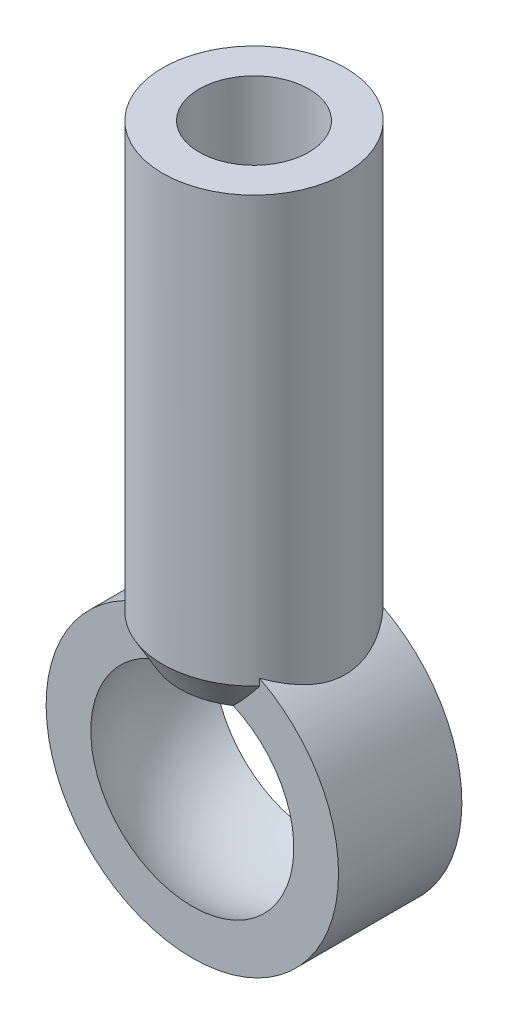
ISO-10303-21;
HEADER;
FILE_DESCRIPTION(('STEP AP214'),'2;1');
FILE_NAME('part.step','',(''),(''),'','','');
FILE_SCHEMA(('AUTOMOTIVE_DESIGN { 1 0 10303 214 1 1 1 1 }'));
ENDSEC;
DATA;
#1=APPLICATION_CONTEXT('core data for automotive mechanical design processes');
#2=APPLICATION_PROTOCOL_DEFINITION('international standard','automotive_design',2000,#1);
#3=PRODUCT_CONTEXT('',#1,'mechanical');
#4=PRODUCT('Part','Part','',(#3));
#5=PRODUCT_RELATED_PRODUCT_CATEGORY('part','',(#4));
#6=PRODUCT_DEFINITION_FORMATION('','',#4);
#7=PRODUCT_DEFINITION_CONTEXT('part definition',#1,'design');
#8=PRODUCT_DEFINITION('design','',#6,#7);
#9=PRODUCT_DEFINITION_SHAPE('','',#8);
#10=(LENGTH_UNIT() NAMED_UNIT(*) SI_UNIT(.MILLI.,.METRE.));
#11=(NAMED_UNIT(*) PLANE_ANGLE_UNIT() SI_UNIT($,.RADIAN.));
#12=(NAMED_UNIT(*) SI_UNIT($,.STERADIAN.) SOLID_ANGLE_UNIT());
#13=UNCERTAINTY_MEASURE_WITH_UNIT(LENGTH_MEASURE(1.E-05),#10,'distance_accuracy_value','');
#14=(GEOMETRIC_REPRESENTATION_CONTEXT(3) GLOBAL_UNCERTAINTY_ASSIGNED_CONTEXT((#13)) GLOBAL_UNIT_ASSIGNED_CONTEXT((#10,
#11,#12)) REPRESENTATION_CONTEXT('',''));
#15=CARTESIAN_POINT('',(0.,0.,0.));
#16=DIRECTION('',(0.,0.,1.));
#17=DIRECTION('',(1.,0.,0.));
#18=AXIS2_PLACEMENT_3D('',#15,#16,#17);
#19=CARTESIAN_POINT('',(0.,6.73205080755679,0.));
#20=DIRECTION('',(0.,1.,0.));
#21=DIRECTION('',(-1.,0.,0.));
#22=AXIS2_PLACEMENT_3D('',#19,#20,#21);
#23=CONICAL_SURFACE('',#22,4.99999999993861,0.523598775586137);
#24=CARTESIAN_POINT('',(3.68908864078673,6.73205080758948,-3.37500000000142));
#25=CARTESIAN_POINT('',(3.62945509849988,6.65584660991955,-3.37500000000052));
#26=CARTESIAN_POINT('',(3.5694180752872,6.57995983206732,-3.37500000000014));
#27=CARTESIAN_POINT('',(3.44842413691964,6.42891840550357,-3.37499999999986));
#28=CARTESIAN_POINT('',(3.38746718365502,6.35376378733649,-3.37499999999995));
#29=CARTESIAN_POINT('',(3.20323751420866,6.12977609863887,-3.3750000000001));
#30=CARTESIAN_POINT('',(3.07842908534393,5.98219170493345,-3.37500000000002));
#31=CARTESIAN_POINT('',(2.88724063361094,5.76422717489113,-3.37499999999999));
#32=CARTESIAN_POINT('',(2.82282776069407,5.69211900485401,-3.375));
#33=CARTESIAN_POINT('',(2.69249479817895,5.54928393811372,-3.375));
#34=CARTESIAN_POINT('',(2.62657481620618,5.47855694344289,-3.375));
#35=CARTESIAN_POINT('',(2.49291016434313,5.33864826117655,-3.375));
#36=CARTESIAN_POINT('',(2.42516302282618,5.269468924927,-3.375));
#37=CARTESIAN_POINT('',(2.28764073093618,5.13312379673095,-3.375));
#38=CARTESIAN_POINT('',(2.21786506552351,5.06595852510341,-3.375));
#39=CARTESIAN_POINT('',(2.14694550463714,5.00000000001996,-3.375));
#40=B_SPLINE_CURVE_WITH_KNOTS('',3,(#24,#25,#26,#27,#28,#29,#30,#31,#32,#33,#34,#35,#36,#37,#38,
#39),.UNSPECIFIED.,.F.,.F.,(4,2,2,2,2,2,2,4),(0.,0.290286504361094,0.580585067550826,
1.16031787910291,1.4503656498475,1.74039277203718,2.03083412301982,2.32134987204626),.UNSPECIFIED.);
#41=CARTESIAN_POINT('',(3.68908864081479,6.73205080757336,-3.375));
#42=VERTEX_POINT('',#41);
#43=CARTESIAN_POINT('',(2.23689041192466,5.08484968165624,-3.375));
#44=VERTEX_POINT('',#43);
#45=EDGE_CURVE('E154',#42,#44,#40,.T.);
#46=ORIENTED_EDGE('',*,*,#45,.T.);
#47=CARTESIAN_POINT('',(0.,5.08484968165624,0.));
#48=DIRECTION('',(0.,-1.,0.));
#49=DIRECTION('',(1.,0.,0.));
#50=AXIS2_PLACEMENT_3D('',#47,#48,#49);
#51=CIRCLE('',#50,4.04898798651718);
#52=CARTESIAN_POINT('',(-2.23689041192466,5.08484968165624,-3.375));
#53=VERTEX_POINT('',#52);
#54=EDGE_CURVE('E96',#44,#53,#51,.F.);
#55=ORIENTED_EDGE('',*,*,#54,.T.);
#56=CARTESIAN_POINT('',(-2.14694550463769,5.00000000001953,-3.37500000000177));
#57=CARTESIAN_POINT('',(-2.21786506552406,5.06595852510358,-3.37500000000064));
#58=CARTESIAN_POINT('',(-2.2876407309369,5.13312379673156,-3.37500000000017));
#59=CARTESIAN_POINT('',(-2.42516302282739,5.26946892492831,-3.37499999999983));
#60=CARTESIAN_POINT('',(-2.49291016434467,5.33864826117815,-3.37499999999995));
#61=CARTESIAN_POINT('',(-2.62657481620829,5.47855694344511,-3.37500000000005));
#62=CARTESIAN_POINT('',(-2.69249479818133,5.54928393811628,-3.37500000000001));
#63=CARTESIAN_POINT('',(-2.82282776069698,5.69211900485724,-3.37499999999999));
#64=CARTESIAN_POINT('',(-2.88724063361411,5.76422717489469,-3.375));
#65=CARTESIAN_POINT('',(-3.07842908534787,5.98219170493805,-3.37500000000001));
#66=CARTESIAN_POINT('',(-3.20323751421307,6.1297760986442,-3.375));
#67=CARTESIAN_POINT('',(-3.38746718366023,6.35376378734284,-3.375));
#68=CARTESIAN_POINT('',(-3.44842413692513,6.42891840551025,-3.375));
#69=CARTESIAN_POINT('',(-3.56941807529305,6.5799598320748,-3.375));
#70=CARTESIAN_POINT('',(-3.62945509850583,6.65584660992752,-3.375));
#71=CARTESIAN_POINT('',(-3.68908864079255,6.7320508075981,-3.375));
#72=B_SPLINE_CURVE_WITH_KNOTS('',3,(#56,#57,#58,#59,#60,#61,#62,#63,#64,#65,#66,#67,#68,#69,#70,
#71),.UNSPECIFIED.,.F.,.F.,(4,2,2,2,2,2,2,4),(0.,0.290515749027707,0.580957100011628,
0.870984222202584,1.16103199294845,1.74076480450312,2.03106336769415,2.32134987205654),.UNSPECIFIED.);
#73=CARTESIAN_POINT('',(-3.68908864084343,6.732050807616,-3.375));
#74=VERTEX_POINT('',#73);
#75=EDGE_CURVE('E160',#53,#74,#72,.T.);
#76=ORIENTED_EDGE('',*,*,#75,.T.);
#77=CARTESIAN_POINT('',(0.,6.73205080756889,0.));
#78=DIRECTION('',(0.,-1.,0.));
#79=DIRECTION('',(0.,0.,-1.));
#80=AXIS2_PLACEMENT_3D('',#77,#78,#79);
#81=CIRCLE('',#80,5.);
#82=EDGE_CURVE('E103',#42,#74,#81,.F.);
#83=ORIENTED_EDGE('',*,*,#82,.F.);
#84=EDGE_LOOP('',(#46,#55,#76,#83));
#85=FACE_BOUND('',#84,.T.);
#86=ADVANCED_FACE('F34',(#85),#23,.T.);
#87=CARTESIAN_POINT('',(0.,6.73205080755679,0.));
#88=DIRECTION('',(0.,1.,0.));
#89=DIRECTION('',(-1.,0.,0.));
#90=AXIS2_PLACEMENT_3D('',#87,#88,#89);
#91=CONICAL_SURFACE('',#90,4.99999999993861,0.523598775586137);
#92=CARTESIAN_POINT('',(-3.68908864079696,6.73205080759336,3.37500000001249));
#93=CARTESIAN_POINT('',(-3.62945509850711,6.65584660992534,3.37500000000459));
#94=CARTESIAN_POINT('',(-3.56941807529303,6.57995983207374,3.37500000000126));
#95=CARTESIAN_POINT('',(-3.44842413692417,6.42891840551009,3.37499999999874));
#96=CARTESIAN_POINT('',(-3.38746718365964,6.35376378734246,3.37499999999957));
#97=CARTESIAN_POINT('',(-3.20323751421308,6.12977609864353,3.37500000000086));
#98=CARTESIAN_POINT('',(-3.07842908534764,5.98219170493767,3.37500000000016));
#99=CARTESIAN_POINT('',(-2.88724063361385,5.76422717489447,3.37499999999992));
#100=CARTESIAN_POINT('',(-2.82282776069676,5.69211900485701,3.37499999999998));
#101=CARTESIAN_POINT('',(-2.69249479818113,5.54928393811606,3.37500000000002));
#102=CARTESIAN_POINT('',(-2.62657481620809,5.47855694344492,3.37500000000001));
#103=CARTESIAN_POINT('',(-2.49291016434451,5.33864826117796,3.37499999999999));
#104=CARTESIAN_POINT('',(-2.42516302282729,5.26946892492811,3.375));
#105=CARTESIAN_POINT('',(-2.28764073093674,5.13312379673149,3.375));
#106=CARTESIAN_POINT('',(-2.21786506552379,5.06595852510367,3.37500000000001));
#107=CARTESIAN_POINT('',(-2.14694550463714,5.00000000001996,3.375));
#108=B_SPLINE_CURVE_WITH_KNOTS('',3,(#92,#93,#94,#95,#96,#97,#98,#99,#100,#101,#102,#103,#104,
#105,#106,#107),.UNSPECIFIED.,.F.,.F.,(4,2,2,2,2,2,2,4),(0.,0.29028650436219,0.580585067553051,
1.16031787910746,1.45036564985328,1.7403927720442,2.03083412302804,2.32134987205566),.UNSPECIFIED.);
#109=CARTESIAN_POINT('',(-3.68908864084343,6.732050807616,3.375));
#110=VERTEX_POINT('',#109);
#111=CARTESIAN_POINT('',(-2.23689041192466,5.08484968165624,3.375));
#112=VERTEX_POINT('',#111);
#113=EDGE_CURVE('E92',#110,#112,#108,.T.);
#114=ORIENTED_EDGE('',*,*,#113,.T.);
#115=CARTESIAN_POINT('',(0.,5.08484968165624,0.));
#116=DIRECTION('',(0.,-1.,0.));
#117=DIRECTION('',(1.,0.,0.));
#118=AXIS2_PLACEMENT_3D('',#115,#116,#117);
#119=CIRCLE('',#118,4.04898798651718);
#120=CARTESIAN_POINT('',(2.23689041192466,5.08484968165624,3.375));
#121=VERTEX_POINT('',#120);
#122=EDGE_CURVE('E11',#112,#121,#119,.F.);
#123=ORIENTED_EDGE('',*,*,#122,.T.);
#124=CARTESIAN_POINT('',(3.68908864080343,6.73205080760019,3.37500000001423));
#125=CARTESIAN_POINT('',(3.62945509851302,6.65584660993231,3.37500000000523));
#126=CARTESIAN_POINT('',(3.56941807529863,6.57995983208064,3.37500000000143));
#127=CARTESIAN_POINT('',(3.44842413692938,6.42891840551668,3.37499999999857));
#128=CARTESIAN_POINT('',(3.38746718366477,6.35376378734881,3.37499999999951));
#129=CARTESIAN_POINT('',(3.20323751421791,6.12977609864919,3.37500000000098));
#130=CARTESIAN_POINT('',(3.07842908535218,5.98219170494294,3.37500000000018));
#131=CARTESIAN_POINT('',(2.88724063361798,5.76422717489912,3.37499999999991));
#132=CARTESIAN_POINT('',(2.82282776070075,5.69211900486145,3.37499999999998));
#133=CARTESIAN_POINT('',(2.69249479818486,5.54928393812009,3.37500000000002));
#134=CARTESIAN_POINT('',(2.62657481621168,5.47855694344873,3.37500000000001));
#135=CARTESIAN_POINT('',(2.49291016434781,5.33864826118137,3.37499999999999));
#136=CARTESIAN_POINT('',(2.42516302283045,5.26946892493131,3.375));
#137=CARTESIAN_POINT('',(2.28764073093962,5.13312379673429,3.375));
#138=CARTESIAN_POINT('',(2.21786506552653,5.06595852510627,3.37500000000001));
#139=CARTESIAN_POINT('',(2.14694550463972,5.00000000002236,3.375));
#140=B_SPLINE_CURVE_WITH_KNOTS('',3,(#124,#125,#126,#127,#128,#129,#130,#131,#132,#133,#134,
#135,#136,#137,#138,#139),.UNSPECIFIED.,.F.,.F.,(4,2,2,2,2,2,2,4),(0.,0.290286504362907,
0.58058506755449,1.16031787911035,1.45036564985691,1.74039277204857,2.03083412303315,
2.32134987206149),.UNSPECIFIED.);
#141=CARTESIAN_POINT('',(3.68908864082056,6.73205080758678,3.375));
#142=VERTEX_POINT('',#141);
#143=EDGE_CURVE('E95',#142,#121,#140,.T.);
#144=ORIENTED_EDGE('',*,*,#143,.F.);
#145=CARTESIAN_POINT('',(0.,6.73205080756889,0.));
#146=DIRECTION('',(0.,-1.,0.));
#147=DIRECTION('',(0.,0.,-1.));
#148=AXIS2_PLACEMENT_3D('',#145,#146,#147);
#149=CIRCLE('',#148,5.);
#150=EDGE_CURVE('E43',#110,#142,#149,.F.);
#151=ORIENTED_EDGE('',*,*,#150,.F.);
#152=EDGE_LOOP('',(#114,#123,#144,#151));
#153=FACE_BOUND('',#152,.T.);
#154=ADVANCED_FACE('F98',(#153),#91,.T.);
#155=CARTESIAN_POINT('',(0.,0.,3.375));
#156=DIRECTION('',(0.,0.,-1.));
#157=DIRECTION('',(-1.,0.,0.));
#158=AXIS2_PLACEMENT_3D('',#155,#156,#157);
#159=CYLINDRICAL_SURFACE('',#158,8.);
#160=CARTESIAN_POINT('',(0.,8.,3.));
#161=CARTESIAN_POINT('',(0.162218842303632,7.99999179258909,2.99998883541571));
#162=CARTESIAN_POINT('',(0.32459724785106,7.99501272405032,2.98677829589102));
#163=CARTESIAN_POINT('',(0.644673504964836,7.97560136905888,2.93441368053213));
#164=CARTESIAN_POINT('',(0.802363825961327,7.96115465050759,2.89521999599549));
#165=CARTESIAN_POINT('',(1.10813814591898,7.9243727992965,2.7924844988798));
#166=CARTESIAN_POINT('',(1.25624601984268,7.90205824201087,2.729006157225));
#167=CARTESIAN_POINT('',(1.53964440000884,7.85176658744964,2.57975987248181));
#168=CARTESIAN_POINT('',(1.67493558383881,7.82378978976857,2.49399310862691));
#169=CARTESIAN_POINT('',(1.9346891200047,7.76372558483114,2.29877716703411));
#170=CARTESIAN_POINT('',(2.05853554723575,7.73152152791065,2.18854456717863));
#171=CARTESIAN_POINT('',(2.28648377916198,7.66720592188017,1.94918513186896));
#172=CARTESIAN_POINT('',(2.39057862423753,7.63509440928927,1.8200516648361));
#173=CARTESIAN_POINT('',(2.57996406613465,7.57324938461639,1.5405649563816));
#174=CARTESIAN_POINT('',(2.66438796802243,7.5436529339983,1.38959105582033));
#175=CARTESIAN_POINT('',(2.80637301826854,7.49199717575482,1.07430306825259));
#176=CARTESIAN_POINT('',(2.8639449328426,7.46993484829952,0.90999435886977));
#177=CARTESIAN_POINT('',(2.94816863458442,7.43708824911684,0.57976644738333));
#178=CARTESIAN_POINT('',(2.97599188500963,7.42587847723187,0.414189775820647));
#179=CARTESIAN_POINT('',(3.00359113443141,7.4147612291611,0.0803675358949781));
#180=CARTESIAN_POINT('',(3.00337874130838,7.41484907530811,-0.0878768990567039));
#181=CARTESIAN_POINT('',(2.97580860618697,7.42595022302475,-0.411538761180788));
#182=CARTESIAN_POINT('',(2.95007622727784,7.43630934027226,-0.5671212420212));
#183=CARTESIAN_POINT('',(2.87488358060584,7.46569868851318,-0.871573735907976));
#184=CARTESIAN_POINT('',(2.82541965141161,7.48473025751641,-1.02044270927959));
#185=CARTESIAN_POINT('',(2.7032734094943,7.52971457154971,-1.31055753026041));
#186=CARTESIAN_POINT('',(2.63016906374988,7.55579158259845,-1.45160558018174));
#187=CARTESIAN_POINT('',(2.46311770242011,7.61188556041071,-1.71989720705547));
#188=CARTESIAN_POINT('',(2.36916444443631,7.64190370609268,-1.84713663252466));
#189=CARTESIAN_POINT('',(2.15565035593563,7.70495586981356,-2.09318831583589));
#190=CARTESIAN_POINT('',(2.03479468728345,7.73805713109076,-2.21086303836618));
#191=CARTESIAN_POINT('',(1.77467657153371,7.8018247459396,-2.42464435086036));
#192=CARTESIAN_POINT('',(1.63540567358529,7.83248997119547,-2.52074098355783));
#193=CARTESIAN_POINT('',(1.33929583128925,7.88855176687111,-2.68993613576149));
#194=CARTESIAN_POINT('',(1.18220994072885,7.913855467045,-2.76263907534527));
#195=CARTESIAN_POINT('',(0.93851325706045,7.94518418048637,-2.85073292475686));
#196=CARTESIAN_POINT('',(0.855970616449073,7.95452022883643,-2.87659802509444));
#197=CARTESIAN_POINT('',(0.688746254663311,7.97073800471096,-2.92114720900516));
#198=CARTESIAN_POINT('',(0.604065480457102,7.97762079903771,-2.93983441417516));
#199=CARTESIAN_POINT('',(0.433191039875368,7.98872189147604,-2.96982707461691));
#200=CARTESIAN_POINT('',(0.346996681338565,7.99293893611189,-2.98112905732969));
#201=CARTESIAN_POINT('',(0.173883499776142,7.99858018613403,-2.99621850131796));
#202=CARTESIAN_POINT('',(0.0869646789380775,8.00000439995037,-3.00000598527566));
#203=CARTESIAN_POINT('',(-0.162218842303631,7.99999179258909,-2.99998883541571));
#204=CARTESIAN_POINT('',(-0.32459724785106,7.99501272405032,-2.98677829589102));
#205=CARTESIAN_POINT('',(-0.644673504964835,7.97560136905888,-2.93441368053213));
#206=CARTESIAN_POINT('',(-0.802363825961326,7.96115465050759,-2.89521999599549));
#207=CARTESIAN_POINT('',(-1.10813814591898,7.9243727992965,-2.7924844988798));
#208=CARTESIAN_POINT('',(-1.25624601984268,7.90205824201087,-2.729006157225));
#209=CARTESIAN_POINT('',(-1.53964440000884,7.85176658744964,-2.57975987248181));
#210=CARTESIAN_POINT('',(-1.67493558383881,7.82378978976857,-2.49399310862691));
#211=CARTESIAN_POINT('',(-1.9346891200047,7.76372558483114,-2.29877716703411));
#212=CARTESIAN_POINT('',(-2.05853554723575,7.73152152791065,-2.18854456717863));
#213=CARTESIAN_POINT('',(-2.28648377916198,7.66720592188017,-1.94918513186896));
#214=CARTESIAN_POINT('',(-2.39057862423753,7.63509440928927,-1.8200516648361));
#215=CARTESIAN_POINT('',(-2.57996406613465,7.5732493846164,-1.5405649563816));
#216=CARTESIAN_POINT('',(-2.66438796802243,7.5436529339983,-1.38959105582033));
#217=CARTESIAN_POINT('',(-2.80637301826854,7.49199717575482,-1.07430306825259));
#218=CARTESIAN_POINT('',(-2.8639449328426,7.46993484829952,-0.909994358869771));
#219=CARTESIAN_POINT('',(-2.94816863458442,7.43708824911684,-0.57976644738333));
#220=CARTESIAN_POINT('',(-2.97599188500963,7.42587847723187,-0.414189775820646));
#221=CARTESIAN_POINT('',(-3.00359113443141,7.4147612291611,-0.0803675358949775));
#222=CARTESIAN_POINT('',(-3.00337874130838,7.41484907530811,0.0878768990567041));
#223=CARTESIAN_POINT('',(-2.97580860618697,7.42595022302475,0.411538761180788));
#224=CARTESIAN_POINT('',(-2.95007622727784,7.43630934027226,0.567121242021199));
#225=CARTESIAN_POINT('',(-2.87488358060584,7.46569868851318,0.871573735907975));
#226=CARTESIAN_POINT('',(-2.82541965141161,7.48473025751641,1.02044270927959));
#227=CARTESIAN_POINT('',(-2.7032734094943,7.52971457154971,1.31055753026041));
#228=CARTESIAN_POINT('',(-2.63016906374988,7.55579158259845,1.45160558018174));
#229=CARTESIAN_POINT('',(-2.46311770242011,7.61188556041071,1.71989720705547));
#230=CARTESIAN_POINT('',(-2.36916444443631,7.64190370609268,1.84713663252466));
#231=CARTESIAN_POINT('',(-2.15565035593563,7.70495586981356,2.09318831583589));
#232=CARTESIAN_POINT('',(-2.03479468728345,7.73805713109076,2.21086303836618));
#233=CARTESIAN_POINT('',(-1.7746765715337,7.8018247459396,2.42464435086036));
#234=CARTESIAN_POINT('',(-1.63540567358529,7.83248997119547,2.52074098355783));
#235=CARTESIAN_POINT('',(-1.33929583128925,7.88855176687111,2.68993613576149));
#236=CARTESIAN_POINT('',(-1.18220994072886,7.913855467045,2.76263907534527));
#237=CARTESIAN_POINT('',(-0.938513257060451,7.94518418048637,2.85073292475686));
#238=CARTESIAN_POINT('',(-0.855970616449072,7.95452022883643,2.87659802509444));
#239=CARTESIAN_POINT('',(-0.688746254663309,7.97073800471096,2.92114720900516));
#240=CARTESIAN_POINT('',(-0.604065480457102,7.97762079903771,2.93983441417516));
#241=CARTESIAN_POINT('',(-0.433191039875368,7.98872189147604,2.96982707461691));
#242=CARTESIAN_POINT('',(-0.346996681338565,7.99293893611189,2.98112905732969));
#243=CARTESIAN_POINT('',(-0.173883499776142,7.99858018613403,2.99621850131796));
#244=CARTESIAN_POINT('',(-0.0869646789380771,8.00000439995037,3.00000598527566));
#245=CARTESIAN_POINT('',(0.,8.,3.));
#246=B_SPLINE_CURVE_WITH_KNOTS('',3,(#160,#161,#162,#163,#164,#165,#166,#167,#168,#169,#170,
#171,#172,#173,#174,#175,#176,#177,#178,#179,#180,#181,#182,#183,#184,#185,#186,#187,#188,#189,
#190,#191,#192,#193,#194,#195,#196,#197,#198,#199,#200,#201,#202,#203,#204,#205,#206,#207,#208,
#209,#210,#211,#212,#213,#214,#215,#216,#217,#218,#219,#220,#221,#222,#223,#224,#225,#226,#227,
#228,#229,#230,#231,#232,#233,#234,#235,#236,#237,#238,#239,#240,#241,#242,#243,#244,#245),
.UNSPECIFIED.,.T.,.F.,(4,2,2,2,2,2,2,2,2,2,2,2,2,2,2,2,2,2,2,2,2,2,2,2,2,2,2,2,2,2,2,2,2,2,2,2,
2,2,2,2,2,2,4),(0.,0.486333028604592,0.973409133198437,1.45922080708889,1.94500678293758,
2.44946074283351,2.95409212216245,3.47793387324542,4.00156541076857,4.50371773332208,
5.00566214533485,5.47756604955742,5.94954278508064,6.43045921805251,6.91151983755537,
7.42484431103955,7.93840517487802,8.4602422626175,8.72095472409521,8.9815536755379,
9.24227507356821,9.50299568462039,9.98932871322498,10.4764048178188,10.9622164917093,
11.448002467558,11.9524564274539,12.4570878067828,12.9809295578658,13.504561095389,
14.0067134179425,14.5086578299552,14.9805617341778,15.452538469701,15.9334549026729,
16.4145155221758,16.9278399956599,17.4414008594984,17.9632379472379,18.2239504087156,
18.4845493601583,18.7452707581886,19.0059913692408),.UNSPECIFIED.);
#247=CARTESIAN_POINT('',(0.,8.,3.));
#248=VERTEX_POINT('',#247);
#249=EDGE_CURVE('E139',#248,#248,#246,.T.);
#250=ORIENTED_EDGE('',*,*,#249,.T.);
#251=EDGE_LOOP('',(#250));
#252=FACE_BOUND('',#251,.T.);
#253=ADVANCED_FACE('F36',(#252),#159,.T.);
#254=CARTESIAN_POINT('',(0.,30.,0.));
#255=DIRECTION('',(0.,-1.,0.));
#256=DIRECTION('',(0.,0.,-1.));
#257=AXIS2_PLACEMENT_3D('',#254,#255,#256);
#258=CYLINDRICAL_SURFACE('',#257,3.);
#259=CARTESIAN_POINT('',(0.,30.,0.));
#260=DIRECTION('',(0.,-1.,0.));
#261=DIRECTION('',(0.,0.,-1.));
#262=AXIS2_PLACEMENT_3D('',#259,#260,#261);
#263=CIRCLE('',#262,3.);
#264=CARTESIAN_POINT('',(0.,30.,-3.));
#265=VERTEX_POINT('',#264);
#266=EDGE_CURVE('E137',#265,#265,#263,.T.);
#267=ORIENTED_EDGE('',*,*,#266,.F.);
#268=EDGE_LOOP('',(#267));
#269=FACE_BOUND('',#268,.T.);
#270=ORIENTED_EDGE('',*,*,#249,.F.);
#271=EDGE_LOOP('',(#270));
#272=FACE_BOUND('',#271,.T.);
#273=ADVANCED_FACE('F144',(#269,#272),#258,.F.);
#274=CARTESIAN_POINT('',(0.,0.,-3.375));
#275=DIRECTION('',(0.,0.,1.));
#276=DIRECTION('',(1.,0.,0.));
#277=AXIS2_PLACEMENT_3D('',#274,#275,#276);
#278=PLANE('',#277);
#279=CARTESIAN_POINT('',(0.,0.,-3.375));
#280=DIRECTION('',(0.,0.,1.));
#281=DIRECTION('',(1.,0.,0.));
#282=AXIS2_PLACEMENT_3D('',#279,#280,#281);
#283=CIRCLE('',#282,5.55512151082224);
#284=EDGE_CURVE('E49',#44,#53,#283,.F.);
#285=ORIENTED_EDGE('',*,*,#284,.F.);
#286=ORIENTED_EDGE('',*,*,#45,.F.);
#287=DIRECTION('',(0.,-1.,0.));
#288=VECTOR('',#287,1.);
#289=CARTESIAN_POINT('',(3.68908864084343,30.,-3.375));
#290=LINE('',#289,#288);
#291=CARTESIAN_POINT('',(3.68908864084343,7.09863543225034,-3.375));
#292=VERTEX_POINT('',#291);
#293=EDGE_CURVE('E204',#292,#42,#290,.T.);
#294=ORIENTED_EDGE('',*,*,#293,.F.);
#295=CARTESIAN_POINT('',(0.,0.,-3.375));
#296=DIRECTION('',(0.,0.,-1.));
#297=DIRECTION('',(-1.,0.,0.));
#298=AXIS2_PLACEMENT_3D('',#295,#296,#297);
#299=CIRCLE('',#298,8.);
#300=CARTESIAN_POINT('',(-3.68908864084343,7.09863543225034,-3.375));
#301=VERTEX_POINT('',#300);
#302=EDGE_CURVE('E100',#301,#292,#299,.F.);
#303=ORIENTED_EDGE('',*,*,#302,.F.);
#304=DIRECTION('',(0.,1.,0.));
#305=VECTOR('',#304,1.);
#306=CARTESIAN_POINT('',(-3.68908864084343,0.,-3.375));
#307=LINE('',#306,#305);
#308=EDGE_CURVE('E136',#74,#301,#307,.T.);
#309=ORIENTED_EDGE('',*,*,#308,.F.);
#310=ORIENTED_EDGE('',*,*,#75,.F.);
#311=EDGE_LOOP('',(#285,#286,#294,#303,#309,#310));
#312=FACE_BOUND('',#311,.T.);
#313=ADVANCED_FACE('F147',(#312),#278,.F.);
#314=CARTESIAN_POINT('',(0.,0.,3.375));
#315=DIRECTION('',(0.,0.,1.));
#316=DIRECTION('',(1.,0.,0.));
#317=AXIS2_PLACEMENT_3D('',#314,#315,#316);
#318=PLANE('',#317);
#319=ORIENTED_EDGE('',*,*,#143,.T.);
#320=CARTESIAN_POINT('',(0.,0.,3.375));
#321=DIRECTION('',(0.,0.,1.));
#322=DIRECTION('',(1.,0.,0.));
#323=AXIS2_PLACEMENT_3D('',#320,#321,#322);
#324=CIRCLE('',#323,5.55512151082224);
#325=EDGE_CURVE('E56',#121,#112,#324,.F.);
#326=ORIENTED_EDGE('',*,*,#325,.T.);
#327=ORIENTED_EDGE('',*,*,#113,.F.);
#328=DIRECTION('',(0.,1.,0.));
#329=VECTOR('',#328,1.);
#330=CARTESIAN_POINT('',(-3.68908864084343,0.,3.375));
#331=LINE('',#330,#329);
#332=CARTESIAN_POINT('',(-3.68908864084343,7.09863543225034,3.375));
#333=VERTEX_POINT('',#332);
#334=EDGE_CURVE('E135',#110,#333,#331,.T.);
#335=ORIENTED_EDGE('',*,*,#334,.T.);
#336=CARTESIAN_POINT('',(0.,0.,3.375));
#337=DIRECTION('',(0.,0.,-1.));
#338=DIRECTION('',(-1.,0.,0.));
#339=AXIS2_PLACEMENT_3D('',#336,#337,#338);
#340=CIRCLE('',#339,8.);
#341=CARTESIAN_POINT('',(3.68908864084343,7.09863543225034,3.375));
#342=VERTEX_POINT('',#341);
#343=EDGE_CURVE('E105',#342,#333,#340,.T.);
#344=ORIENTED_EDGE('',*,*,#343,.F.);
#345=DIRECTION('',(0.,-1.,0.));
#346=VECTOR('',#345,1.);
#347=CARTESIAN_POINT('',(3.68908864084343,30.,3.375));
#348=LINE('',#347,#346);
#349=EDGE_CURVE('E190',#142,#342,#348,.F.);
#350=ORIENTED_EDGE('',*,*,#349,.F.);
#351=EDGE_LOOP('',(#319,#326,#327,#335,#344,#350));
#352=FACE_BOUND('',#351,.T.);
#353=ADVANCED_FACE('F91',(#352),#318,.T.);
#354=CARTESIAN_POINT('',(0.,30.,0.));
#355=DIRECTION('',(0.,1.,0.));
#356=DIRECTION('',(0.,0.,1.));
#357=AXIS2_PLACEMENT_3D('',#354,#355,#356);
#358=PLANE('',#357);
#359=ORIENTED_EDGE('',*,*,#266,.T.);
#360=EDGE_LOOP('',(#359));
#361=FACE_BOUND('',#360,.T.);
#362=CARTESIAN_POINT('',(0.,30.,0.));
#363=DIRECTION('',(0.,-1.,0.));
#364=DIRECTION('',(0.,0.,-1.));
#365=AXIS2_PLACEMENT_3D('',#362,#363,#364);
#366=CIRCLE('',#365,5.);
#367=CARTESIAN_POINT('',(0.,30.,-5.));
#368=VERTEX_POINT('',#367);
#369=EDGE_CURVE('E99',#368,#368,#366,.T.);
#370=ORIENTED_EDGE('',*,*,#369,.F.);
#371=EDGE_LOOP('',(#370));
#372=FACE_BOUND('',#371,.T.);
#373=ADVANCED_FACE('F168',(#361,#372),#358,.T.);
#374=CARTESIAN_POINT('',(0.,0.,3.375));
#375=DIRECTION('',(0.,0.,-1.));
#376=DIRECTION('',(-1.,0.,0.));
#377=AXIS2_PLACEMENT_3D('',#374,#375,#376);
#378=CYLINDRICAL_SURFACE('',#377,8.);
#379=CARTESIAN_POINT('',(-3.68908864084343,7.09863543225034,-3.375));
#380=CARTESIAN_POINT('',(-3.78061104630861,7.05108201125406,-3.27494171281128));
#381=CARTESIAN_POINT('',(-3.8680503607771,7.00338277018195,-3.17120912988661));
#382=CARTESIAN_POINT('',(-4.03445348896767,6.90885762686041,-2.95663167917465));
#383=CARTESIAN_POINT('',(-4.11341028990232,6.86203247327253,-2.84578104577521));
#384=CARTESIAN_POINT('',(-4.26296781678639,6.77014601805922,-2.61647952954411));
#385=CARTESIAN_POINT('',(-4.33349866948544,6.7251012952627,-2.49797617499024));
#386=CARTESIAN_POINT('',(-4.46495368964816,6.63855225048895,-2.25462690774136));
#387=CARTESIAN_POINT('',(-4.52588117774652,6.59704670702915,-2.12978320723022));
#388=CARTESIAN_POINT('',(-4.67596670030075,6.49219353373839,-1.78621427456888));
#389=CARTESIAN_POINT('',(-4.75584173041072,6.4333799458973,-1.56180500524996));
#390=CARTESIAN_POINT('',(-4.85141751585339,6.3612360362507,-1.21576133352354));
#391=CARTESIAN_POINT('',(-4.87921891462346,6.33988252568356,-1.09897872221991));
#392=CARTESIAN_POINT('',(-4.92646077746893,6.30324389856647,-0.862817853365085));
#393=CARTESIAN_POINT('',(-4.94590556223798,6.2879556463577,-0.743440970777811));
#394=CARTESIAN_POINT('',(-4.97623455511696,6.26398187562185,-0.502005298805961));
#395=CARTESIAN_POINT('',(-4.98705195905824,6.25534789993969,-0.379932961946408));
#396=CARTESIAN_POINT('',(-4.99968026010243,6.24525926901694,-0.135022941796556));
#397=CARTESIAN_POINT('',(-5.00149118146083,6.24380459444168,-0.0121852605683096));
#398=CARTESIAN_POINT('',(-4.99606617307036,6.24814669204929,0.233198700772724));
#399=CARTESIAN_POINT('',(-4.98882778728561,6.25394543285254,0.355744892728041));
#400=CARTESIAN_POINT('',(-4.9654512610404,6.27251969656207,0.599414060982091));
#401=CARTESIAN_POINT('',(-4.94931335949122,6.2852950321786,0.720537075397485));
#402=CARTESIAN_POINT('',(-4.89192529607196,6.33019230378912,1.05696046097111));
#403=CARTESIAN_POINT('',(-4.84091640427555,6.36961111241674,1.26971624094788));
#404=CARTESIAN_POINT('',(-4.71303196669152,6.46479850575159,1.68359907967881));
#405=CARTESIAN_POINT('',(-4.6361051917398,6.52059944297825,1.88470217587775));
#406=CARTESIAN_POINT('',(-4.43757579581215,6.65775180173899,2.31897089286329));
#407=CARTESIAN_POINT('',(-4.30969718451661,6.74202337726453,2.54837153089297));
#408=CARTESIAN_POINT('',(-4.09406652075352,6.87355076410929,2.87323029660389));
#409=CARTESIAN_POINT('',(-4.01841075320884,6.91814422170987,2.97810251082703));
#410=CARTESIAN_POINT('',(-3.8594379058055,7.00807208123194,3.18140238776007));
#411=CARTESIAN_POINT('',(-3.77612622582697,7.05340594265295,3.27983451017959));
#412=CARTESIAN_POINT('',(-3.68908864084343,7.09863543225034,3.375));
#413=B_SPLINE_CURVE_WITH_KNOTS('',3,(#379,#380,#381,#382,#383,#384,#385,#386,#387,#388,#389,
#390,#391,#392,#393,#394,#395,#396,#397,#398,#399,#400,#401,#402,#403,#404,#405,#406,#407,#408,
#409,#410,#411,#412),.UNSPECIFIED.,.F.,.F.,(4,2,2,2,2,2,2,2,2,2,2,2,2,2,2,2,4),(0.,
0.430998737670263,0.862351098461146,1.29706315434422,1.73162456492847,2.4641139091651,
2.82953582310882,3.19476857177077,3.5628026816039,3.93083580027829,4.29896882702207,
4.66709197155968,5.33106652079615,5.99636125454379,6.82004398476898,7.23010833638621,
7.63988564875537),.UNSPECIFIED.);
#414=EDGE_CURVE('E187',#301,#333,#413,.T.);
#415=ORIENTED_EDGE('',*,*,#414,.F.);
#416=ORIENTED_EDGE('',*,*,#302,.T.);
#417=CARTESIAN_POINT('',(3.68908864084343,7.09863543225034,3.375));
#418=CARTESIAN_POINT('',(3.78061104630861,7.05108201125406,3.27494171281128));
#419=CARTESIAN_POINT('',(3.86805036077709,7.00338277018195,3.17120912988661));
#420=CARTESIAN_POINT('',(4.03445348896767,6.90885762686041,2.95663167917465));
#421=CARTESIAN_POINT('',(4.11341028990232,6.86203247327253,2.84578104577521));
#422=CARTESIAN_POINT('',(4.26296781678639,6.77014601805922,2.61647952954411));
#423=CARTESIAN_POINT('',(4.33349866948544,6.7251012952627,2.49797617499024));
#424=CARTESIAN_POINT('',(4.46495368964816,6.63855225048895,2.25462690774136));
#425=CARTESIAN_POINT('',(4.52588117774652,6.59704670702915,2.12978320723022));
#426=CARTESIAN_POINT('',(4.67596670030075,6.49219353373839,1.78621427456888));
#427=CARTESIAN_POINT('',(4.75584173041072,6.4333799458973,1.56180500524996));
#428=CARTESIAN_POINT('',(4.85141751585339,6.3612360362507,1.21576133352354));
#429=CARTESIAN_POINT('',(4.87921891462346,6.33988252568356,1.09897872221992));
#430=CARTESIAN_POINT('',(4.92646077746893,6.30324389856647,0.862817853365086));
#431=CARTESIAN_POINT('',(4.94590556223798,6.2879556463577,0.743440970777812));
#432=CARTESIAN_POINT('',(4.97623455511696,6.26398187562186,0.502005298805962));
#433=CARTESIAN_POINT('',(4.98705195905824,6.25534789993969,0.379932961946409));
#434=CARTESIAN_POINT('',(4.99968026010243,6.24525926901695,0.135022941796558));
#435=CARTESIAN_POINT('',(5.00149118146083,6.24380459444168,0.0121852605683114));
#436=CARTESIAN_POINT('',(4.99606617307036,6.24814669204929,-0.233198700772722));
#437=CARTESIAN_POINT('',(4.98882778728561,6.25394543285254,-0.355744892728039));
#438=CARTESIAN_POINT('',(4.9654512610404,6.27251969656207,-0.599414060982089));
#439=CARTESIAN_POINT('',(4.94931335949122,6.2852950321786,-0.720537075397483));
#440=CARTESIAN_POINT('',(4.89192529607196,6.33019230378912,-1.05696046097111));
#441=CARTESIAN_POINT('',(4.84091640427555,6.36961111241674,-1.26971624094788));
#442=CARTESIAN_POINT('',(4.71303196669152,6.46479850575159,-1.68359907967881));
#443=CARTESIAN_POINT('',(4.6361051917398,6.52059944297825,-1.88470217587775));
#444=CARTESIAN_POINT('',(4.43757579581216,6.65775180173899,-2.31897089286329));
#445=CARTESIAN_POINT('',(4.30969718451661,6.74202337726453,-2.54837153089297));
#446=CARTESIAN_POINT('',(4.09406652075352,6.87355076410929,-2.87323029660389));
#447=CARTESIAN_POINT('',(4.01841075320884,6.91814422170987,-2.97810251082703));
#448=CARTESIAN_POINT('',(3.85943790580551,7.00807208123194,-3.18140238776006));
#449=CARTESIAN_POINT('',(3.77612622582697,7.05340594265295,-3.27983451017958));
#450=CARTESIAN_POINT('',(3.68908864084343,7.09863543225034,-3.375));
#451=B_SPLINE_CURVE_WITH_KNOTS('',3,(#417,#418,#419,#420,#421,#422,#423,#424,#425,#426,#427,
#428,#429,#430,#431,#432,#433,#434,#435,#436,#437,#438,#439,#440,#441,#442,#443,#444,#445,#446,
#447,#448,#449,#450),.UNSPECIFIED.,.F.,.F.,(4,2,2,2,2,2,2,2,2,2,2,2,2,2,2,2,4),(0.,
0.430998737670263,0.862351098461146,1.29706315434422,1.73162456492847,2.46411390916509,
2.82953582310882,3.19476857177077,3.5628026816039,3.93083580027829,4.29896882702206,
4.66709197155968,5.33106652079615,5.99636125454378,6.82004398476898,7.23010833638621,
7.63988564875537),.UNSPECIFIED.);
#452=EDGE_CURVE('E203',#342,#292,#451,.T.);
#453=ORIENTED_EDGE('',*,*,#452,.F.);
#454=ORIENTED_EDGE('',*,*,#343,.T.);
#455=EDGE_LOOP('',(#415,#416,#453,#454));
#456=FACE_BOUND('',#455,.T.);
#457=ADVANCED_FACE('F125',(#456),#378,.T.);
#458=CARTESIAN_POINT('',(0.,30.,0.));
#459=DIRECTION('',(0.,-1.,0.));
#460=DIRECTION('',(0.,0.,-1.));
#461=AXIS2_PLACEMENT_3D('',#458,#459,#460);
#462=CYLINDRICAL_SURFACE('',#461,5.);
#463=ORIENTED_EDGE('',*,*,#369,.T.);
#464=EDGE_LOOP('',(#463));
#465=FACE_BOUND('',#464,.T.);
#466=ORIENTED_EDGE('',*,*,#334,.F.);
#467=ORIENTED_EDGE('',*,*,#150,.T.);
#468=ORIENTED_EDGE('',*,*,#349,.T.);
#469=ORIENTED_EDGE('',*,*,#452,.T.);
#470=ORIENTED_EDGE('',*,*,#293,.T.);
#471=ORIENTED_EDGE('',*,*,#82,.T.);
#472=ORIENTED_EDGE('',*,*,#308,.T.);
#473=ORIENTED_EDGE('',*,*,#414,.T.);
#474=EDGE_LOOP('',(#466,#467,#468,#469,#470,#471,#472,#473));
#475=FACE_BOUND('',#474,.T.);
#476=ADVANCED_FACE('F122',(#465,#475),#462,.T.);
#477=CARTESIAN_POINT('',(0.,0.,0.));
#478=DIRECTION('',(0.,0.,-1.));
#479=DIRECTION('',(1.,0.,0.));
#480=AXIS2_PLACEMENT_3D('',#477,#478,#479);
#481=SPHERICAL_SURFACE('',#480,6.5);
#482=ORIENTED_EDGE('',*,*,#122,.F.);
#483=ORIENTED_EDGE('',*,*,#325,.F.);
#484=EDGE_LOOP('',(#482,#483));
#485=FACE_BOUND('',#484,.T.);
#486=ORIENTED_EDGE('',*,*,#284,.T.);
#487=ORIENTED_EDGE('',*,*,#54,.F.);
#488=EDGE_LOOP('',(#486,#487));
#489=FACE_BOUND('',#488,.T.);
#490=ADVANCED_FACE('F84',(#485,#489),#481,.F.);
#491=CLOSED_SHELL('',(#86,#154,#253,#273,#313,#353,#373,#457,#476,#490));
#492=MANIFOLD_SOLID_BREP('B2',#491);
#493=ADVANCED_BREP_SHAPE_REPRESENTATION('',(#18,#492),#14);
#494=SHAPE_DEFINITION_REPRESENTATION(#9,#493);
ENDSEC;
END-ISO-10303-21;
